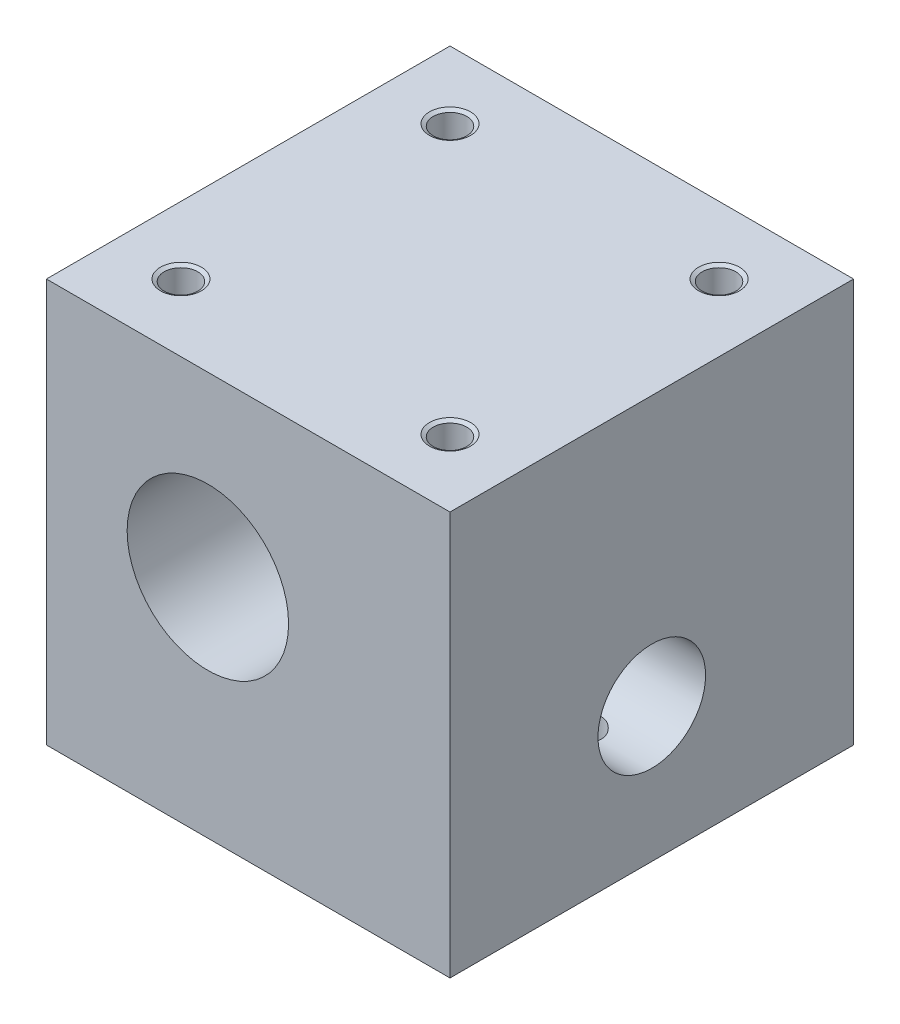
ISO-10303-21;
HEADER;
FILE_DESCRIPTION(('STEP AP214'),'2;1');
FILE_NAME('part.step','',(''),(''),'','','');
FILE_SCHEMA(('AUTOMOTIVE_DESIGN { 1 0 10303 214 1 1 1 1 }'));
ENDSEC;
DATA;
#1=APPLICATION_CONTEXT('core data for automotive mechanical design processes');
#2=APPLICATION_PROTOCOL_DEFINITION('international standard','automotive_design',2000,#1);
#3=PRODUCT_CONTEXT('',#1,'mechanical');
#4=PRODUCT('Part','Part','',(#3));
#5=PRODUCT_RELATED_PRODUCT_CATEGORY('part','',(#4));
#6=PRODUCT_DEFINITION_FORMATION('','',#4);
#7=PRODUCT_DEFINITION_CONTEXT('part definition',#1,'design');
#8=PRODUCT_DEFINITION('design','',#6,#7);
#9=PRODUCT_DEFINITION_SHAPE('','',#8);
#10=(LENGTH_UNIT() NAMED_UNIT(*) SI_UNIT(.MILLI.,.METRE.));
#11=(NAMED_UNIT(*) PLANE_ANGLE_UNIT() SI_UNIT($,.RADIAN.));
#12=(NAMED_UNIT(*) SI_UNIT($,.STERADIAN.) SOLID_ANGLE_UNIT());
#13=UNCERTAINTY_MEASURE_WITH_UNIT(LENGTH_MEASURE(1.E-05),#10,'distance_accuracy_value','');
#14=(GEOMETRIC_REPRESENTATION_CONTEXT(3) GLOBAL_UNCERTAINTY_ASSIGNED_CONTEXT((#13)) GLOBAL_UNIT_ASSIGNED_CONTEXT((#10,
#11,#12)) REPRESENTATION_CONTEXT('',''));
#15=CARTESIAN_POINT('',(0.,0.,0.));
#16=DIRECTION('',(0.,0.,1.));
#17=DIRECTION('',(1.,0.,0.));
#18=AXIS2_PLACEMENT_3D('',#15,#16,#17);
#19=CARTESIAN_POINT('',(0.,30.,30.));
#20=DIRECTION('',(0.,-1.,0.));
#21=DIRECTION('',(0.,0.,-1.));
#22=AXIS2_PLACEMENT_3D('',#19,#20,#21);
#23=PLANE('',#22);
#24=DIRECTION('',(-1.,0.,0.));
#25=VECTOR('',#24,1.);
#26=CARTESIAN_POINT('',(0.,30.,0.));
#27=LINE('',#26,#25);
#28=CARTESIAN_POINT('',(30.,30.,0.));
#29=VERTEX_POINT('',#28);
#30=CARTESIAN_POINT('',(0.,30.,0.));
#31=VERTEX_POINT('',#30);
#32=EDGE_CURVE('E82',#29,#31,#27,.T.);
#33=ORIENTED_EDGE('',*,*,#32,.T.);
#34=DIRECTION('',(0.,0.,-1.));
#35=VECTOR('',#34,1.);
#36=CARTESIAN_POINT('',(0.,30.,30.));
#37=LINE('',#36,#35);
#38=CARTESIAN_POINT('',(0.,30.,30.));
#39=VERTEX_POINT('',#38);
#40=EDGE_CURVE('E168',#39,#31,#37,.T.);
#41=ORIENTED_EDGE('',*,*,#40,.F.);
#42=DIRECTION('',(-1.,0.,0.));
#43=VECTOR('',#42,1.);
#44=CARTESIAN_POINT('',(0.,30.,30.));
#45=LINE('',#44,#43);
#46=CARTESIAN_POINT('',(30.,30.,30.));
#47=VERTEX_POINT('',#46);
#48=EDGE_CURVE('E58',#47,#39,#45,.T.);
#49=ORIENTED_EDGE('',*,*,#48,.F.);
#50=DIRECTION('',(0.,0.,-1.));
#51=VECTOR('',#50,1.);
#52=CARTESIAN_POINT('',(30.,30.,30.));
#53=LINE('',#52,#51);
#54=EDGE_CURVE('E176',#47,#29,#53,.T.);
#55=ORIENTED_EDGE('',*,*,#54,.T.);
#56=EDGE_LOOP('',(#33,#41,#49,#55));
#57=FACE_BOUND('',#56,.T.);
#58=CARTESIAN_POINT('',(25.,30.,25.));
#59=DIRECTION('',(0.,1.,0.));
#60=DIRECTION('',(0.,0.,1.));
#61=AXIS2_PLACEMENT_3D('',#58,#59,#60);
#62=CIRCLE('',#61,1.525);
#63=CARTESIAN_POINT('',(25.,30.,26.525));
#64=VERTEX_POINT('',#63);
#65=EDGE_CURVE('E140',#64,#64,#62,.T.);
#66=ORIENTED_EDGE('',*,*,#65,.F.);
#67=EDGE_LOOP('',(#66));
#68=FACE_BOUND('',#67,.T.);
#69=CARTESIAN_POINT('',(5.,30.,25.));
#70=DIRECTION('',(0.,1.,0.));
#71=DIRECTION('',(0.,0.,1.));
#72=AXIS2_PLACEMENT_3D('',#69,#70,#71);
#73=CIRCLE('',#72,1.525);
#74=CARTESIAN_POINT('',(5.,30.,26.525));
#75=VERTEX_POINT('',#74);
#76=EDGE_CURVE('E131',#75,#75,#73,.T.);
#77=ORIENTED_EDGE('',*,*,#76,.F.);
#78=EDGE_LOOP('',(#77));
#79=FACE_BOUND('',#78,.T.);
#80=CARTESIAN_POINT('',(25.,30.,5.));
#81=DIRECTION('',(0.,1.,0.));
#82=DIRECTION('',(0.,0.,1.));
#83=AXIS2_PLACEMENT_3D('',#80,#81,#82);
#84=CIRCLE('',#83,1.525);
#85=CARTESIAN_POINT('',(25.,30.,6.525));
#86=VERTEX_POINT('',#85);
#87=EDGE_CURVE('E115',#86,#86,#84,.T.);
#88=ORIENTED_EDGE('',*,*,#87,.F.);
#89=EDGE_LOOP('',(#88));
#90=FACE_BOUND('',#89,.T.);
#91=CARTESIAN_POINT('',(5.,30.,5.));
#92=DIRECTION('',(0.,1.,0.));
#93=DIRECTION('',(0.,0.,1.));
#94=AXIS2_PLACEMENT_3D('',#91,#92,#93);
#95=CIRCLE('',#94,1.525);
#96=CARTESIAN_POINT('',(5.,30.,6.525));
#97=VERTEX_POINT('',#96);
#98=EDGE_CURVE('E122',#97,#97,#95,.T.);
#99=ORIENTED_EDGE('',*,*,#98,.F.);
#100=EDGE_LOOP('',(#99));
#101=FACE_BOUND('',#100,.T.);
#102=ADVANCED_FACE('F36',(#57,#68,#79,#90,#101),#23,.F.);
#103=CARTESIAN_POINT('',(0.,0.,30.));
#104=DIRECTION('',(0.,0.,-1.));
#105=DIRECTION('',(-1.,0.,0.));
#106=AXIS2_PLACEMENT_3D('',#103,#104,#105);
#107=PLANE('',#106);
#108=DIRECTION('',(0.,-1.,0.));
#109=VECTOR('',#108,1.);
#110=CARTESIAN_POINT('',(0.,0.,30.));
#111=LINE('',#110,#109);
#112=CARTESIAN_POINT('',(0.,0.,30.));
#113=VERTEX_POINT('',#112);
#114=EDGE_CURVE('E162',#39,#113,#111,.T.);
#115=ORIENTED_EDGE('',*,*,#114,.T.);
#116=DIRECTION('',(1.,0.,0.));
#117=VECTOR('',#116,1.);
#118=CARTESIAN_POINT('',(0.,0.,30.));
#119=LINE('',#118,#117);
#120=CARTESIAN_POINT('',(30.,0.,30.));
#121=VERTEX_POINT('',#120);
#122=EDGE_CURVE('E89',#113,#121,#119,.T.);
#123=ORIENTED_EDGE('',*,*,#122,.T.);
#124=DIRECTION('',(0.,1.,0.));
#125=VECTOR('',#124,1.);
#126=CARTESIAN_POINT('',(30.,0.,30.));
#127=LINE('',#126,#125);
#128=EDGE_CURVE('E165',#121,#47,#127,.T.);
#129=ORIENTED_EDGE('',*,*,#128,.T.);
#130=ORIENTED_EDGE('',*,*,#48,.T.);
#131=EDGE_LOOP('',(#115,#123,#129,#130));
#132=FACE_BOUND('',#131,.T.);
#133=CARTESIAN_POINT('',(12.,16.8,30.));
#134=DIRECTION('',(0.,0.,1.));
#135=DIRECTION('',(1.,0.,0.));
#136=AXIS2_PLACEMENT_3D('',#133,#134,#135);
#137=CIRCLE('',#136,6.);
#138=CARTESIAN_POINT('',(18.,16.8,30.));
#139=VERTEX_POINT('',#138);
#140=EDGE_CURVE('E156',#139,#139,#137,.T.);
#141=ORIENTED_EDGE('',*,*,#140,.F.);
#142=EDGE_LOOP('',(#141));
#143=FACE_BOUND('',#142,.T.);
#144=ADVANCED_FACE('F189',(#132,#143),#107,.F.);
#145=CARTESIAN_POINT('',(0.,0.,0.));
#146=DIRECTION('',(0.,0.,-1.));
#147=DIRECTION('',(-1.,0.,0.));
#148=AXIS2_PLACEMENT_3D('',#145,#146,#147);
#149=PLANE('',#148);
#150=DIRECTION('',(0.,-1.,0.));
#151=VECTOR('',#150,1.);
#152=CARTESIAN_POINT('',(0.,0.,0.));
#153=LINE('',#152,#151);
#154=CARTESIAN_POINT('',(0.,0.,0.));
#155=VERTEX_POINT('',#154);
#156=EDGE_CURVE('E159',#31,#155,#153,.T.);
#157=ORIENTED_EDGE('',*,*,#156,.F.);
#158=ORIENTED_EDGE('',*,*,#32,.F.);
#159=DIRECTION('',(0.,1.,0.));
#160=VECTOR('',#159,1.);
#161=CARTESIAN_POINT('',(30.,0.,0.));
#162=LINE('',#161,#160);
#163=CARTESIAN_POINT('',(30.,0.,0.));
#164=VERTEX_POINT('',#163);
#165=EDGE_CURVE('E76',#164,#29,#162,.T.);
#166=ORIENTED_EDGE('',*,*,#165,.F.);
#167=DIRECTION('',(1.,0.,0.));
#168=VECTOR('',#167,1.);
#169=CARTESIAN_POINT('',(0.,0.,0.));
#170=LINE('',#169,#168);
#171=EDGE_CURVE('E171',#155,#164,#170,.T.);
#172=ORIENTED_EDGE('',*,*,#171,.F.);
#173=EDGE_LOOP('',(#157,#158,#166,#172));
#174=FACE_BOUND('',#173,.T.);
#175=CARTESIAN_POINT('',(12.,16.8,0.));
#176=DIRECTION('',(0.,0.,1.));
#177=DIRECTION('',(1.,0.,0.));
#178=AXIS2_PLACEMENT_3D('',#175,#176,#177);
#179=CIRCLE('',#178,6.);
#180=CARTESIAN_POINT('',(18.,16.8,0.));
#181=VERTEX_POINT('',#180);
#182=EDGE_CURVE('E155',#181,#181,#179,.T.);
#183=ORIENTED_EDGE('',*,*,#182,.T.);
#184=EDGE_LOOP('',(#183));
#185=FACE_BOUND('',#184,.T.);
#186=ADVANCED_FACE('F182',(#174,#185),#149,.T.);
#187=CARTESIAN_POINT('',(0.,0.,30.));
#188=DIRECTION('',(1.,0.,0.));
#189=DIRECTION('',(0.,0.,-1.));
#190=AXIS2_PLACEMENT_3D('',#187,#188,#189);
#191=PLANE('',#190);
#192=ORIENTED_EDGE('',*,*,#156,.T.);
#193=DIRECTION('',(0.,0.,-1.));
#194=VECTOR('',#193,1.);
#195=CARTESIAN_POINT('',(0.,0.,30.));
#196=LINE('',#195,#194);
#197=EDGE_CURVE('E11',#113,#155,#196,.T.);
#198=ORIENTED_EDGE('',*,*,#197,.F.);
#199=ORIENTED_EDGE('',*,*,#114,.F.);
#200=ORIENTED_EDGE('',*,*,#40,.T.);
#201=EDGE_LOOP('',(#192,#198,#199,#200));
#202=FACE_BOUND('',#201,.T.);
#203=ADVANCED_FACE('F38',(#202),#191,.F.);
#204=CARTESIAN_POINT('',(0.,0.,30.));
#205=DIRECTION('',(0.,1.,0.));
#206=DIRECTION('',(0.,0.,1.));
#207=AXIS2_PLACEMENT_3D('',#204,#205,#206);
#208=PLANE('',#207);
#209=CARTESIAN_POINT('',(25.,0.,15.));
#210=DIRECTION('',(0.,-1.,0.));
#211=DIRECTION('',(0.,0.,-1.));
#212=AXIS2_PLACEMENT_3D('',#209,#210,#211);
#213=CIRCLE('',#212,1.25);
#214=CARTESIAN_POINT('',(25.,0.,13.75));
#215=VERTEX_POINT('',#214);
#216=EDGE_CURVE('E201',#215,#215,#213,.T.);
#217=ORIENTED_EDGE('',*,*,#216,.F.);
#218=EDGE_LOOP('',(#217));
#219=FACE_BOUND('',#218,.T.);
#220=ORIENTED_EDGE('',*,*,#171,.T.);
#221=DIRECTION('',(0.,0.,-1.));
#222=VECTOR('',#221,1.);
#223=CARTESIAN_POINT('',(30.,0.,30.));
#224=LINE('',#223,#222);
#225=EDGE_CURVE('E50',#121,#164,#224,.T.);
#226=ORIENTED_EDGE('',*,*,#225,.F.);
#227=ORIENTED_EDGE('',*,*,#122,.F.);
#228=ORIENTED_EDGE('',*,*,#197,.T.);
#229=EDGE_LOOP('',(#220,#226,#227,#228));
#230=FACE_BOUND('',#229,.T.);
#231=ADVANCED_FACE('F209',(#219,#230),#208,.F.);
#232=CARTESIAN_POINT('',(30.,0.,30.));
#233=DIRECTION('',(-1.,0.,0.));
#234=DIRECTION('',(0.,0.,1.));
#235=AXIS2_PLACEMENT_3D('',#232,#233,#234);
#236=PLANE('',#235);
#237=CARTESIAN_POINT('',(30.,10.,15.));
#238=DIRECTION('',(1.,0.,0.));
#239=DIRECTION('',(0.,0.,-1.));
#240=AXIS2_PLACEMENT_3D('',#237,#238,#239);
#241=CIRCLE('',#240,4.);
#242=CARTESIAN_POINT('',(30.,10.,11.));
#243=VERTEX_POINT('',#242);
#244=EDGE_CURVE('E149',#243,#243,#241,.T.);
#245=ORIENTED_EDGE('',*,*,#244,.F.);
#246=EDGE_LOOP('',(#245));
#247=FACE_BOUND('',#246,.T.);
#248=ORIENTED_EDGE('',*,*,#165,.T.);
#249=ORIENTED_EDGE('',*,*,#54,.F.);
#250=ORIENTED_EDGE('',*,*,#128,.F.);
#251=ORIENTED_EDGE('',*,*,#225,.T.);
#252=EDGE_LOOP('',(#248,#249,#250,#251));
#253=FACE_BOUND('',#252,.T.);
#254=ADVANCED_FACE('F179',(#247,#253),#236,.F.);
#255=CARTESIAN_POINT('',(12.,16.8,30.));
#256=DIRECTION('',(0.,0.,-1.));
#257=DIRECTION('',(-1.,0.,0.));
#258=AXIS2_PLACEMENT_3D('',#255,#256,#257);
#259=CYLINDRICAL_SURFACE('',#258,6.);
#260=ORIENTED_EDGE('',*,*,#140,.T.);
#261=EDGE_LOOP('',(#260));
#262=FACE_BOUND('',#261,.T.);
#263=ORIENTED_EDGE('',*,*,#182,.F.);
#264=EDGE_LOOP('',(#263));
#265=FACE_BOUND('',#264,.T.);
#266=ADVANCED_FACE('F215',(#262,#265),#259,.F.);
#267=CARTESIAN_POINT('',(18.,10.,15.));
#268=DIRECTION('',(1.,0.,0.));
#269=DIRECTION('',(0.,0.,-1.));
#270=AXIS2_PLACEMENT_3D('',#267,#268,#269);
#271=CONICAL_SURFACE('',#270,4.,1.02974425867665);
#272=CARTESIAN_POINT('',(15.5965575238898,10.,15.));
#273=VERTEX_POINT('',#272);
#274=VERTEX_LOOP('',#273);
#275=FACE_BOUND('',#274,.T.);
#276=CARTESIAN_POINT('',(18.,10.,15.));
#277=DIRECTION('',(1.,0.,0.));
#278=DIRECTION('',(0.,0.,-1.));
#279=AXIS2_PLACEMENT_3D('',#276,#277,#278);
#280=CIRCLE('',#279,4.);
#281=CARTESIAN_POINT('',(18.,10.,11.));
#282=VERTEX_POINT('',#281);
#283=EDGE_CURVE('E152',#282,#282,#280,.T.);
#284=ORIENTED_EDGE('',*,*,#283,.T.);
#285=EDGE_LOOP('',(#284));
#286=FACE_BOUND('',#285,.T.);
#287=ADVANCED_FACE('F225',(#275,#286),#271,.F.);
#288=CARTESIAN_POINT('',(30.,10.,15.));
#289=DIRECTION('',(1.,0.,0.));
#290=DIRECTION('',(0.,0.,-1.));
#291=AXIS2_PLACEMENT_3D('',#288,#289,#290);
#292=CYLINDRICAL_SURFACE('',#291,4.);
#293=CARTESIAN_POINT('',(25.,6.20032896160733,13.75));
#294=CARTESIAN_POINT('',(25.0683470361093,6.20032854038064,13.7500004621995));
#295=CARTESIAN_POINT('',(25.1366987687032,6.19846468494957,13.7556246120851));
#296=CARTESIAN_POINT('',(25.2713941608778,6.19124361001123,13.7779082459867));
#297=CARTESIAN_POINT('',(25.3377372727322,6.18588544646864,13.7945707121748));
#298=CARTESIAN_POINT('',(25.466444901932,6.17234061164041,13.8383021177644));
#299=CARTESIAN_POINT('',(25.5288162331057,6.16415894805683,13.8653526426332));
#300=CARTESIAN_POINT('',(25.648152695864,6.14589593781312,13.9290308582684));
#301=CARTESIAN_POINT('',(25.7051168699601,6.1358142556416,13.9656602409437));
#302=CARTESIAN_POINT('',(25.8139788674935,6.1144987233138,14.0488039293777));
#303=CARTESIAN_POINT('',(25.865663609436,6.1032387661522,14.0955906002796));
#304=CARTESIAN_POINT('',(25.9605960132092,6.08105754139665,14.1971379535445));
#305=CARTESIAN_POINT('',(26.0038424969448,6.07013632127373,14.2518997474814));
#306=CARTESIAN_POINT('',(26.0816110630112,6.04956446609922,14.3693740875066));
#307=CARTESIAN_POINT('',(26.1159137038315,6.0399481543722,14.4322384434799));
#308=CARTESIAN_POINT('',(26.1733760498555,6.02337448166981,14.5631957671466));
#309=CARTESIAN_POINT('',(26.1965383741496,6.01641649580081,14.6312875015129));
#310=CARTESIAN_POINT('',(26.2303511280971,6.00612824179138,14.7685356430339));
#311=CARTESIAN_POINT('',(26.2413657497878,6.00269261015857,14.8375942845318));
#312=CARTESIAN_POINT('',(26.2517243464375,5.99946404123985,14.9766591860155));
#313=CARTESIAN_POINT('',(26.2510709743588,5.99967027589935,15.0466652269731));
#314=CARTESIAN_POINT('',(26.2383517084141,6.00362883867463,15.1830744803547));
#315=CARTESIAN_POINT('',(26.226680616487,6.00725849027843,15.249518634314));
#316=CARTESIAN_POINT('',(26.192905009957,6.01750517439145,15.3794530633478));
#317=CARTESIAN_POINT('',(26.1707998149134,6.02412240172866,15.4429431454812));
#318=CARTESIAN_POINT('',(26.1165298109251,6.03976540270467,15.5660781031548));
#319=CARTESIAN_POINT('',(26.084245191437,6.04881966383043,15.6256664056228));
#320=CARTESIAN_POINT('',(26.0106289002954,6.06838277046438,15.738702511152));
#321=CARTESIAN_POINT('',(25.9692949408622,6.07889198355416,15.7921487562088));
#322=CARTESIAN_POINT('',(25.8767263651987,6.10076329265354,15.8937376984539));
#323=CARTESIAN_POINT('',(25.8251509311588,6.11214268010916,15.9415665490942));
#324=CARTESIAN_POINT('',(25.7146048981755,6.13409384559588,16.0279897425954));
#325=CARTESIAN_POINT('',(25.655633429425,6.14466552840153,16.0665829977534));
#326=CARTESIAN_POINT('',(25.5310825311402,6.16389153351026,16.1338046501977));
#327=CARTESIAN_POINT('',(25.4654365909576,6.17252309645677,16.1623168070268));
#328=CARTESIAN_POINT('',(25.3299405081046,6.18662454661087,16.2077834594851));
#329=CARTESIAN_POINT('',(25.2600918857895,6.19209556966707,16.2247421076579));
#330=CARTESIAN_POINT('',(25.1211800474342,6.19900436608128,16.2460148518571));
#331=CARTESIAN_POINT('',(25.0521980037679,6.20059533610304,16.2508095435371));
#332=CARTESIAN_POINT('',(24.9144102585018,6.19998922536016,16.2489674449831));
#333=CARTESIAN_POINT('',(24.8456045312995,6.19779272991611,16.2423324211146));
#334=CARTESIAN_POINT('',(24.7121917033483,6.19001042517126,16.2182487351314));
#335=CARTESIAN_POINT('',(24.647520725926,6.18452445898268,16.2011183116054));
#336=CARTESIAN_POINT('',(24.521978208004,6.1708871266834,16.1569037366103));
#337=CARTESIAN_POINT('',(24.4611072890788,6.16273532587613,16.1298179617115));
#338=CARTESIAN_POINT('',(24.3429608902282,6.14439460346844,16.0655751065587));
#339=CARTESIAN_POINT('',(24.2858385844072,6.13415396510267,16.0281514748856));
#340=CARTESIAN_POINT('',(24.1785096536381,6.11289651027172,15.9446064086798));
#341=CARTESIAN_POINT('',(24.1283048310747,6.10187949264298,15.8984827146908));
#342=CARTESIAN_POINT('',(24.0340896340872,6.07975812437321,15.7965729477536));
#343=CARTESIAN_POINT('',(23.9904222138601,6.06866907714321,15.7404656497885));
#344=CARTESIAN_POINT('',(23.9131089566787,6.04810940156322,15.6214515456514));
#345=CARTESIAN_POINT('',(23.879462660689,6.03863869909054,15.5585450511086));
#346=CARTESIAN_POINT('',(23.8234694375283,6.02243688071488,15.4281055233318));
#347=CARTESIAN_POINT('',(23.8010407121563,6.015686004388,15.3606101842838));
#348=CARTESIAN_POINT('',(23.7679274614103,6.00559757351424,15.2225572540564));
#349=CARTESIAN_POINT('',(23.7572392609165,6.00225895085723,15.1520006283404));
#350=CARTESIAN_POINT('',(23.7482089982504,5.99944196595539,15.0129849366489));
#351=CARTESIAN_POINT('',(23.7493715498292,5.9998087059261,14.9445608080535));
#352=CARTESIAN_POINT('',(23.7628118110487,6.00399021918952,14.8089267780768));
#353=CARTESIAN_POINT('',(23.7750887959919,6.00780476767381,14.7417167978204));
#354=CARTESIAN_POINT('',(23.8100940092223,6.01840429155204,14.6112448815192));
#355=CARTESIAN_POINT('',(23.8326896078454,6.02515152039795,14.5479440815505));
#356=CARTESIAN_POINT('',(23.8875708272085,6.0409205441205,14.4260015744999));
#357=CARTESIAN_POINT('',(23.9198581099734,6.04994272908642,14.3673606687255));
#358=CARTESIAN_POINT('',(23.9944727583444,6.06970103116624,14.2542383050303));
#359=CARTESIAN_POINT('',(24.037103522464,6.08048490249038,14.1999653929469));
#360=CARTESIAN_POINT('',(24.1306598894435,6.10241263452939,14.0991792086007));
#361=CARTESIAN_POINT('',(24.1815879741394,6.11355660215174,14.0526682664958));
#362=CARTESIAN_POINT('',(24.2923157198411,6.13538107422562,13.9671713408875));
#363=CARTESIAN_POINT('',(24.3523534031166,6.14603399136544,13.9284857200529));
#364=CARTESIAN_POINT('',(24.4783981202691,6.16519874720469,13.8617952925148));
#365=CARTESIAN_POINT('',(24.5444027264502,6.17371145138614,13.8337861659645));
#366=CARTESIAN_POINT('',(24.6747226173147,6.18693439559673,13.7912881956421));
#367=CARTESIAN_POINT('',(24.7387025474516,6.19190684956251,13.7758506016213));
#368=CARTESIAN_POINT('',(24.8684538320965,6.19860393517602,13.755207541839));
#369=CARTESIAN_POINT('',(24.9342247412015,6.20032936698402,13.7499995551922));
#370=CARTESIAN_POINT('',(25.,6.20032896160733,13.75));
#371=B_SPLINE_CURVE_WITH_KNOTS('',3,(#293,#294,#295,#296,#297,#298,#299,#300,#301,#302,#303,
#304,#305,#306,#307,#308,#309,#310,#311,#312,#313,#314,#315,#316,#317,#318,#319,#320,#321,#322,
#323,#324,#325,#326,#327,#328,#329,#330,#331,#332,#333,#334,#335,#336,#337,#338,#339,#340,#341,
#342,#343,#344,#345,#346,#347,#348,#349,#350,#351,#352,#353,#354,#355,#356,#357,#358,#359,#360,
#361,#362,#363,#364,#365,#366,#367,#368,#369,#370),.UNSPECIFIED.,.T.,.F.,(4,2,2,2,2,2,2,2,2,2,2,
2,2,2,2,2,2,2,2,2,2,2,2,2,2,2,2,2,2,2,2,2,2,2,2,2,2,2,4),(0.,0.20479813754849,0.409651627059736,
0.614143644118583,0.818671804924948,1.02957080550838,1.24049922941123,1.45619821963733,
1.67184647417922,1.88083722835534,2.08978046471775,2.29150982969751,2.49325235190094,
2.69746404608409,2.90172742713188,3.11450338937334,3.32730439853777,3.54248470934455,
3.75758763952754,3.96404933287936,4.1704791221909,4.37093972044364,4.57143302253211,
4.77767613309612,4.98397288011881,5.19881937811513,5.41365603317088,5.62690239290999,
5.84008198140586,6.04438802439526,6.24868074692308,6.4504184651476,6.65219079911653,
6.86080693105216,7.06948557772192,7.28507795501706,7.50058300803823,7.69772354371388,
7.89481549188781),.UNSPECIFIED.);
#372=CARTESIAN_POINT('',(25.,6.20032896160733,13.75));
#373=VERTEX_POINT('',#372);
#374=EDGE_CURVE('E40',#373,#373,#371,.T.);
#375=ORIENTED_EDGE('',*,*,#374,.T.);
#376=EDGE_LOOP('',(#375));
#377=FACE_BOUND('',#376,.T.);
#378=ORIENTED_EDGE('',*,*,#283,.F.);
#379=EDGE_LOOP('',(#378));
#380=FACE_BOUND('',#379,.T.);
#381=ORIENTED_EDGE('',*,*,#244,.T.);
#382=EDGE_LOOP('',(#381));
#383=FACE_BOUND('',#382,.T.);
#384=ADVANCED_FACE('F228',(#377,#380,#383),#292,.F.);
#385=CARTESIAN_POINT('',(25.,21.5,25.));
#386=DIRECTION('',(0.,1.,0.));
#387=DIRECTION('',(0.,0.,1.));
#388=AXIS2_PLACEMENT_3D('',#385,#386,#387);
#389=CONICAL_SURFACE('',#388,1.24999999999999,1.02974425867665);
#390=CARTESIAN_POINT('',(25.,20.7489242262155,25.));
#391=VERTEX_POINT('',#390);
#392=VERTEX_LOOP('',#391);
#393=FACE_BOUND('',#392,.T.);
#394=CARTESIAN_POINT('',(25.,21.5,25.));
#395=DIRECTION('',(0.,1.,0.));
#396=DIRECTION('',(0.,0.,1.));
#397=AXIS2_PLACEMENT_3D('',#394,#395,#396);
#398=CIRCLE('',#397,1.24999999999999);
#399=CARTESIAN_POINT('',(25.,21.5,26.25));
#400=VERTEX_POINT('',#399);
#401=EDGE_CURVE('E146',#400,#400,#398,.T.);
#402=ORIENTED_EDGE('',*,*,#401,.T.);
#403=EDGE_LOOP('',(#402));
#404=FACE_BOUND('',#403,.T.);
#405=ADVANCED_FACE('F233',(#393,#404),#389,.F.);
#406=CARTESIAN_POINT('',(25.,30.,25.));
#407=DIRECTION('',(0.,1.,0.));
#408=DIRECTION('',(0.,0.,1.));
#409=AXIS2_PLACEMENT_3D('',#406,#407,#408);
#410=CYLINDRICAL_SURFACE('',#409,1.25);
#411=ORIENTED_EDGE('',*,*,#401,.F.);
#412=EDGE_LOOP('',(#411));
#413=FACE_BOUND('',#412,.T.);
#414=CARTESIAN_POINT('',(25.,29.8412286759729,25.));
#415=DIRECTION('',(0.,1.,0.));
#416=DIRECTION('',(0.,0.,1.));
#417=AXIS2_PLACEMENT_3D('',#414,#415,#416);
#418=CIRCLE('',#417,1.25);
#419=CARTESIAN_POINT('',(25.,29.8412286759729,26.25));
#420=VERTEX_POINT('',#419);
#421=EDGE_CURVE('E143',#420,#420,#418,.T.);
#422=ORIENTED_EDGE('',*,*,#421,.T.);
#423=EDGE_LOOP('',(#422));
#424=FACE_BOUND('',#423,.T.);
#425=ADVANCED_FACE('F237',(#413,#424),#410,.F.);
#426=CARTESIAN_POINT('',(25.,30.,25.));
#427=DIRECTION('',(0.,1.,0.));
#428=DIRECTION('',(0.,0.,1.));
#429=AXIS2_PLACEMENT_3D('',#426,#427,#428);
#430=CONICAL_SURFACE('',#429,1.525,1.0471975511966);
#431=ORIENTED_EDGE('',*,*,#421,.F.);
#432=EDGE_LOOP('',(#431));
#433=FACE_BOUND('',#432,.T.);
#434=ORIENTED_EDGE('',*,*,#65,.T.);
#435=EDGE_LOOP('',(#434));
#436=FACE_BOUND('',#435,.T.);
#437=ADVANCED_FACE('F241',(#433,#436),#430,.F.);
#438=CARTESIAN_POINT('',(5.,21.5,25.));
#439=DIRECTION('',(0.,1.,0.));
#440=DIRECTION('',(0.,0.,1.));
#441=AXIS2_PLACEMENT_3D('',#438,#439,#440);
#442=CONICAL_SURFACE('',#441,1.25,1.02974425867665);
#443=CARTESIAN_POINT('',(5.,20.7489242262155,25.));
#444=VERTEX_POINT('',#443);
#445=VERTEX_LOOP('',#444);
#446=FACE_BOUND('',#445,.T.);
#447=CARTESIAN_POINT('',(5.,21.5,25.));
#448=DIRECTION('',(0.,1.,0.));
#449=DIRECTION('',(0.,0.,1.));
#450=AXIS2_PLACEMENT_3D('',#447,#448,#449);
#451=CIRCLE('',#450,1.25);
#452=CARTESIAN_POINT('',(5.,21.5,26.25));
#453=VERTEX_POINT('',#452);
#454=EDGE_CURVE('E137',#453,#453,#451,.T.);
#455=ORIENTED_EDGE('',*,*,#454,.T.);
#456=EDGE_LOOP('',(#455));
#457=FACE_BOUND('',#456,.T.);
#458=ADVANCED_FACE('F245',(#446,#457),#442,.F.);
#459=CARTESIAN_POINT('',(5.,30.,25.));
#460=DIRECTION('',(0.,1.,0.));
#461=DIRECTION('',(0.,0.,1.));
#462=AXIS2_PLACEMENT_3D('',#459,#460,#461);
#463=CYLINDRICAL_SURFACE('',#462,1.25);
#464=ORIENTED_EDGE('',*,*,#454,.F.);
#465=EDGE_LOOP('',(#464));
#466=FACE_BOUND('',#465,.T.);
#467=CARTESIAN_POINT('',(5.,29.8412286759729,25.));
#468=DIRECTION('',(0.,1.,0.));
#469=DIRECTION('',(0.,0.,1.));
#470=AXIS2_PLACEMENT_3D('',#467,#468,#469);
#471=CIRCLE('',#470,1.25);
#472=CARTESIAN_POINT('',(5.,29.8412286759729,26.25));
#473=VERTEX_POINT('',#472);
#474=EDGE_CURVE('E134',#473,#473,#471,.T.);
#475=ORIENTED_EDGE('',*,*,#474,.T.);
#476=EDGE_LOOP('',(#475));
#477=FACE_BOUND('',#476,.T.);
#478=ADVANCED_FACE('F249',(#466,#477),#463,.F.);
#479=CARTESIAN_POINT('',(5.,30.,25.));
#480=DIRECTION('',(0.,1.,0.));
#481=DIRECTION('',(0.,0.,1.));
#482=AXIS2_PLACEMENT_3D('',#479,#480,#481);
#483=CONICAL_SURFACE('',#482,1.525,1.0471975511966);
#484=ORIENTED_EDGE('',*,*,#474,.F.);
#485=EDGE_LOOP('',(#484));
#486=FACE_BOUND('',#485,.T.);
#487=ORIENTED_EDGE('',*,*,#76,.T.);
#488=EDGE_LOOP('',(#487));
#489=FACE_BOUND('',#488,.T.);
#490=ADVANCED_FACE('F253',(#486,#489),#483,.F.);
#491=CARTESIAN_POINT('',(25.,21.5,5.));
#492=DIRECTION('',(0.,1.,0.));
#493=DIRECTION('',(0.,0.,1.));
#494=AXIS2_PLACEMENT_3D('',#491,#492,#493);
#495=CONICAL_SURFACE('',#494,1.24999999999999,1.02974425867665);
#496=CARTESIAN_POINT('',(25.,20.7489242262155,5.));
#497=VERTEX_POINT('',#496);
#498=VERTEX_LOOP('',#497);
#499=FACE_BOUND('',#498,.T.);
#500=CARTESIAN_POINT('',(25.,21.5,5.));
#501=DIRECTION('',(0.,1.,0.));
#502=DIRECTION('',(0.,0.,1.));
#503=AXIS2_PLACEMENT_3D('',#500,#501,#502);
#504=CIRCLE('',#503,1.24999999999999);
#505=CARTESIAN_POINT('',(25.,21.5,6.25));
#506=VERTEX_POINT('',#505);
#507=EDGE_CURVE('E128',#506,#506,#504,.T.);
#508=ORIENTED_EDGE('',*,*,#507,.T.);
#509=EDGE_LOOP('',(#508));
#510=FACE_BOUND('',#509,.T.);
#511=ADVANCED_FACE('F257',(#499,#510),#495,.F.);
#512=CARTESIAN_POINT('',(25.,30.,5.));
#513=DIRECTION('',(0.,1.,0.));
#514=DIRECTION('',(0.,0.,1.));
#515=AXIS2_PLACEMENT_3D('',#512,#513,#514);
#516=CYLINDRICAL_SURFACE('',#515,1.25);
#517=ORIENTED_EDGE('',*,*,#507,.F.);
#518=EDGE_LOOP('',(#517));
#519=FACE_BOUND('',#518,.T.);
#520=CARTESIAN_POINT('',(25.,29.8412286759729,5.));
#521=DIRECTION('',(0.,1.,0.));
#522=DIRECTION('',(0.,0.,1.));
#523=AXIS2_PLACEMENT_3D('',#520,#521,#522);
#524=CIRCLE('',#523,1.25);
#525=CARTESIAN_POINT('',(25.,29.8412286759729,6.25));
#526=VERTEX_POINT('',#525);
#527=EDGE_CURVE('E119',#526,#526,#524,.T.);
#528=ORIENTED_EDGE('',*,*,#527,.T.);
#529=EDGE_LOOP('',(#528));
#530=FACE_BOUND('',#529,.T.);
#531=ADVANCED_FACE('F261',(#519,#530),#516,.F.);
#532=CARTESIAN_POINT('',(25.,30.,5.));
#533=DIRECTION('',(0.,1.,0.));
#534=DIRECTION('',(0.,0.,1.));
#535=AXIS2_PLACEMENT_3D('',#532,#533,#534);
#536=CONICAL_SURFACE('',#535,1.525,1.0471975511966);
#537=ORIENTED_EDGE('',*,*,#527,.F.);
#538=EDGE_LOOP('',(#537));
#539=FACE_BOUND('',#538,.T.);
#540=ORIENTED_EDGE('',*,*,#87,.T.);
#541=EDGE_LOOP('',(#540));
#542=FACE_BOUND('',#541,.T.);
#543=ADVANCED_FACE('F109',(#539,#542),#536,.F.);
#544=CARTESIAN_POINT('',(5.,21.5,5.));
#545=DIRECTION('',(0.,1.,0.));
#546=DIRECTION('',(0.,0.,1.));
#547=AXIS2_PLACEMENT_3D('',#544,#545,#546);
#548=CONICAL_SURFACE('',#547,1.25,1.02974425867665);
#549=CARTESIAN_POINT('',(5.,20.7489242262155,5.));
#550=VERTEX_POINT('',#549);
#551=VERTEX_LOOP('',#550);
#552=FACE_BOUND('',#551,.T.);
#553=CARTESIAN_POINT('',(5.,21.5,5.));
#554=DIRECTION('',(0.,1.,0.));
#555=DIRECTION('',(0.,0.,1.));
#556=AXIS2_PLACEMENT_3D('',#553,#554,#555);
#557=CIRCLE('',#556,1.25);
#558=CARTESIAN_POINT('',(5.,21.5,6.25));
#559=VERTEX_POINT('',#558);
#560=EDGE_CURVE('E113',#559,#559,#557,.T.);
#561=ORIENTED_EDGE('',*,*,#560,.T.);
#562=EDGE_LOOP('',(#561));
#563=FACE_BOUND('',#562,.T.);
#564=ADVANCED_FACE('F105',(#552,#563),#548,.F.);
#565=CARTESIAN_POINT('',(5.,30.,5.));
#566=DIRECTION('',(0.,1.,0.));
#567=DIRECTION('',(0.,0.,1.));
#568=AXIS2_PLACEMENT_3D('',#565,#566,#567);
#569=CYLINDRICAL_SURFACE('',#568,1.25);
#570=ORIENTED_EDGE('',*,*,#560,.F.);
#571=EDGE_LOOP('',(#570));
#572=FACE_BOUND('',#571,.T.);
#573=CARTESIAN_POINT('',(5.,29.8412286759729,5.));
#574=DIRECTION('',(0.,1.,0.));
#575=DIRECTION('',(0.,0.,1.));
#576=AXIS2_PLACEMENT_3D('',#573,#574,#575);
#577=CIRCLE('',#576,1.25);
#578=CARTESIAN_POINT('',(5.,29.8412286759729,6.25));
#579=VERTEX_POINT('',#578);
#580=EDGE_CURVE('E116',#579,#579,#577,.T.);
#581=ORIENTED_EDGE('',*,*,#580,.T.);
#582=EDGE_LOOP('',(#581));
#583=FACE_BOUND('',#582,.T.);
#584=ADVANCED_FACE('F108',(#572,#583),#569,.F.);
#585=CARTESIAN_POINT('',(5.,30.,5.));
#586=DIRECTION('',(0.,1.,0.));
#587=DIRECTION('',(0.,0.,1.));
#588=AXIS2_PLACEMENT_3D('',#585,#586,#587);
#589=CONICAL_SURFACE('',#588,1.525,1.0471975511966);
#590=ORIENTED_EDGE('',*,*,#580,.F.);
#591=EDGE_LOOP('',(#590));
#592=FACE_BOUND('',#591,.T.);
#593=ORIENTED_EDGE('',*,*,#98,.T.);
#594=EDGE_LOOP('',(#593));
#595=FACE_BOUND('',#594,.T.);
#596=ADVANCED_FACE('F271',(#592,#595),#589,.F.);
#597=CARTESIAN_POINT('',(25.,10.,15.));
#598=DIRECTION('',(0.,-1.,0.));
#599=DIRECTION('',(0.,0.,-1.));
#600=AXIS2_PLACEMENT_3D('',#597,#598,#599);
#601=CYLINDRICAL_SURFACE('',#600,1.25);
#602=ORIENTED_EDGE('',*,*,#216,.T.);
#603=EDGE_LOOP('',(#602));
#604=FACE_BOUND('',#603,.T.);
#605=ORIENTED_EDGE('',*,*,#374,.F.);
#606=EDGE_LOOP('',(#605));
#607=FACE_BOUND('',#606,.T.);
#608=ADVANCED_FACE('F206',(#604,#607),#601,.F.);
#609=CLOSED_SHELL('',(#102,#144,#186,#203,#231,#254,#266,#287,#384,#405,#425,#437,#458,#478,
#490,#511,#531,#543,#564,#584,#596,#608));
#610=MANIFOLD_SOLID_BREP('B2',#609);
#611=ADVANCED_BREP_SHAPE_REPRESENTATION('',(#18,#610),#14);
#612=SHAPE_DEFINITION_REPRESENTATION(#9,#611);
ENDSEC;
END-ISO-10303-21;
